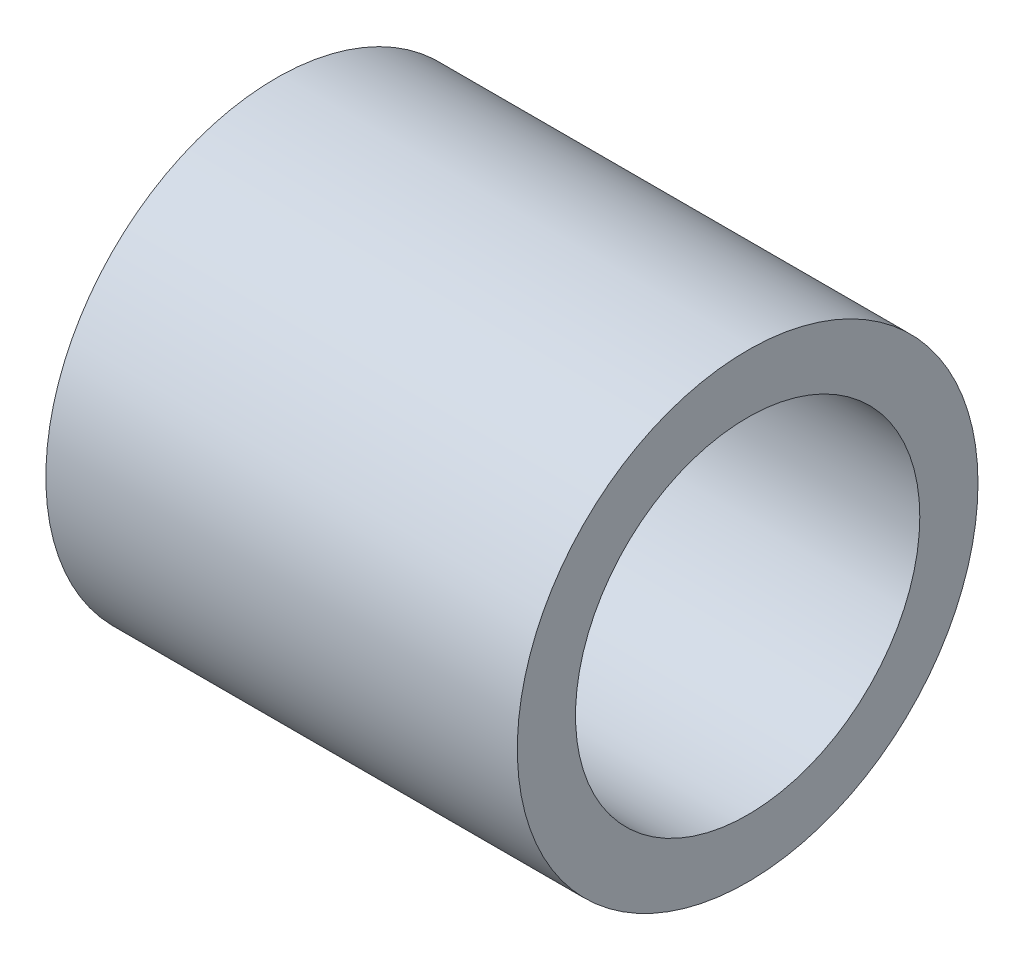
ISO-10303-21;
HEADER;
FILE_DESCRIPTION(('STEP AP214'),'2;1');
FILE_NAME('part.step','',(''),(''),'','','');
FILE_SCHEMA(('AUTOMOTIVE_DESIGN { 1 0 10303 214 1 1 1 1 }'));
ENDSEC;
DATA;
#1=APPLICATION_CONTEXT('core data for automotive mechanical design processes');
#2=APPLICATION_PROTOCOL_DEFINITION('international standard','automotive_design',2000,#1);
#3=PRODUCT_CONTEXT('',#1,'mechanical');
#4=PRODUCT('Part','Part','',(#3));
#5=PRODUCT_RELATED_PRODUCT_CATEGORY('part','',(#4));
#6=PRODUCT_DEFINITION_FORMATION('','',#4);
#7=PRODUCT_DEFINITION_CONTEXT('part definition',#1,'design');
#8=PRODUCT_DEFINITION('design','',#6,#7);
#9=PRODUCT_DEFINITION_SHAPE('','',#8);
#10=(LENGTH_UNIT() NAMED_UNIT(*) SI_UNIT(.MILLI.,.METRE.));
#11=(NAMED_UNIT(*) PLANE_ANGLE_UNIT() SI_UNIT($,.RADIAN.));
#12=(NAMED_UNIT(*) SI_UNIT($,.STERADIAN.) SOLID_ANGLE_UNIT());
#13=UNCERTAINTY_MEASURE_WITH_UNIT(LENGTH_MEASURE(1.E-05),#10,'distance_accuracy_value','');
#14=(GEOMETRIC_REPRESENTATION_CONTEXT(3) GLOBAL_UNCERTAINTY_ASSIGNED_CONTEXT((#13)) GLOBAL_UNIT_ASSIGNED_CONTEXT((#10,
#11,#12)) REPRESENTATION_CONTEXT('',''));
#15=CARTESIAN_POINT('',(0.,0.,0.));
#16=DIRECTION('',(0.,0.,1.));
#17=DIRECTION('',(1.,0.,0.));
#18=AXIS2_PLACEMENT_3D('',#15,#16,#17);
#19=CARTESIAN_POINT('',(-11.1125,0.,0.));
#20=DIRECTION('',(1.,0.,0.));
#21=DIRECTION('',(0.,0.,-1.));
#22=AXIS2_PLACEMENT_3D('',#19,#20,#21);
#23=CYLINDRICAL_SURFACE('',#22,8.1153);
#24=CARTESIAN_POINT('',(11.1125,0.,0.));
#25=DIRECTION('',(1.,0.,0.));
#26=DIRECTION('',(0.,0.,-1.));
#27=AXIS2_PLACEMENT_3D('',#24,#25,#26);
#28=CIRCLE('',#27,8.1153);
#29=CARTESIAN_POINT('',(11.1125,0.,-8.1153));
#30=VERTEX_POINT('',#29);
#31=EDGE_CURVE('E17',#30,#30,#28,.F.);
#32=ORIENTED_EDGE('',*,*,#31,.F.);
#33=EDGE_LOOP('',(#32));
#34=FACE_BOUND('',#33,.T.);
#35=CARTESIAN_POINT('',(-11.1125,0.,0.));
#36=DIRECTION('',(1.,0.,0.));
#37=DIRECTION('',(0.,0.,-1.));
#38=AXIS2_PLACEMENT_3D('',#35,#36,#37);
#39=CIRCLE('',#38,8.1153);
#40=CARTESIAN_POINT('',(-11.1125,0.,-8.1153));
#41=VERTEX_POINT('',#40);
#42=EDGE_CURVE('E26',#41,#41,#39,.F.);
#43=ORIENTED_EDGE('',*,*,#42,.T.);
#44=EDGE_LOOP('',(#43));
#45=FACE_BOUND('',#44,.T.);
#46=ADVANCED_FACE('F14',(#34,#45),#23,.F.);
#47=CARTESIAN_POINT('',(11.1125,0.,0.));
#48=DIRECTION('',(1.,0.,0.));
#49=DIRECTION('',(0.,0.,-1.));
#50=AXIS2_PLACEMENT_3D('',#47,#48,#49);
#51=PLANE('',#50);
#52=ORIENTED_EDGE('',*,*,#31,.T.);
#53=EDGE_LOOP('',(#52));
#54=FACE_BOUND('',#53,.T.);
#55=CARTESIAN_POINT('',(11.1125,0.,0.));
#56=DIRECTION('',(1.,0.,0.));
#57=DIRECTION('',(0.,0.,-1.));
#58=AXIS2_PLACEMENT_3D('',#55,#56,#57);
#59=CIRCLE('',#58,10.8585);
#60=CARTESIAN_POINT('',(11.1125,0.,-10.8585));
#61=VERTEX_POINT('',#60);
#62=EDGE_CURVE('E21',#61,#61,#59,.F.);
#63=ORIENTED_EDGE('',*,*,#62,.F.);
#64=EDGE_LOOP('',(#63));
#65=FACE_BOUND('',#64,.T.);
#66=ADVANCED_FACE('F34',(#54,#65),#51,.T.);
#67=CARTESIAN_POINT('',(-11.1125,0.,0.));
#68=DIRECTION('',(1.,0.,0.));
#69=DIRECTION('',(0.,0.,-1.));
#70=AXIS2_PLACEMENT_3D('',#67,#68,#69);
#71=PLANE('',#70);
#72=ORIENTED_EDGE('',*,*,#42,.F.);
#73=EDGE_LOOP('',(#72));
#74=FACE_BOUND('',#73,.T.);
#75=CARTESIAN_POINT('',(-11.1125,0.,0.));
#76=DIRECTION('',(1.,0.,0.));
#77=DIRECTION('',(0.,0.,-1.));
#78=AXIS2_PLACEMENT_3D('',#75,#76,#77);
#79=CIRCLE('',#78,10.8585);
#80=CARTESIAN_POINT('',(-11.1125,0.,-10.8585));
#81=VERTEX_POINT('',#80);
#82=EDGE_CURVE('E10',#81,#81,#79,.T.);
#83=ORIENTED_EDGE('',*,*,#82,.F.);
#84=EDGE_LOOP('',(#83));
#85=FACE_BOUND('',#84,.T.);
#86=ADVANCED_FACE('F42',(#74,#85),#71,.F.);
#87=CARTESIAN_POINT('',(-11.1125,0.,0.));
#88=DIRECTION('',(1.,0.,0.));
#89=DIRECTION('',(0.,0.,-1.));
#90=AXIS2_PLACEMENT_3D('',#87,#88,#89);
#91=CYLINDRICAL_SURFACE('',#90,10.8585);
#92=ORIENTED_EDGE('',*,*,#62,.T.);
#93=EDGE_LOOP('',(#92));
#94=FACE_BOUND('',#93,.T.);
#95=ORIENTED_EDGE('',*,*,#82,.T.);
#96=EDGE_LOOP('',(#95));
#97=FACE_BOUND('',#96,.T.);
#98=ADVANCED_FACE('F43',(#94,#97),#91,.T.);
#99=CLOSED_SHELL('',(#46,#66,#86,#98));
#100=MANIFOLD_SOLID_BREP('B1',#99);
#101=ADVANCED_BREP_SHAPE_REPRESENTATION('',(#18,#100),#14);
#102=SHAPE_DEFINITION_REPRESENTATION(#9,#101);
ENDSEC;
END-ISO-10303-21;
